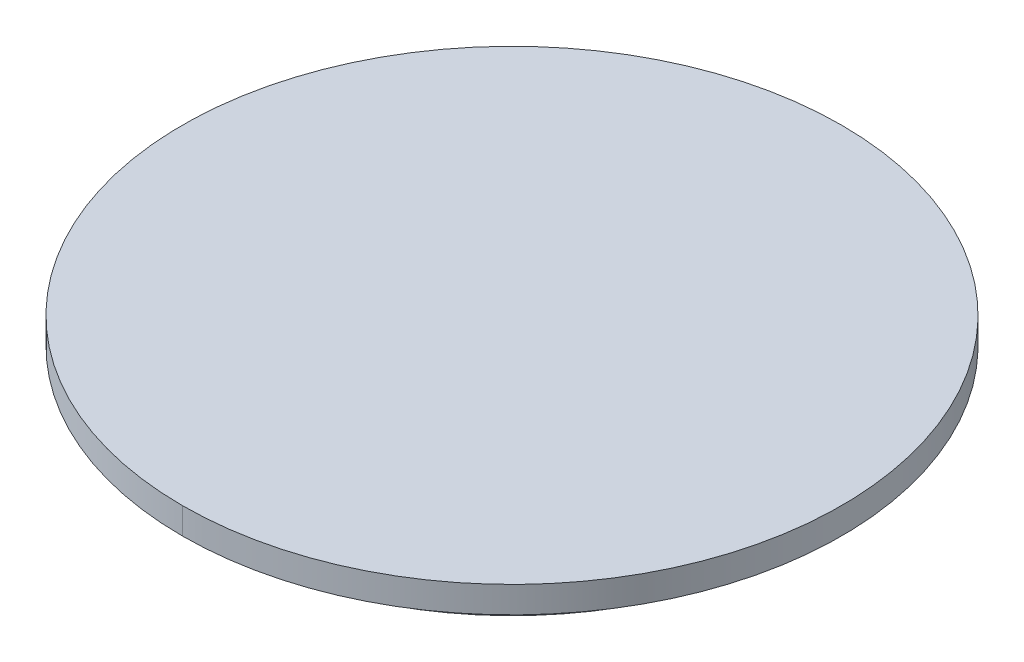
ISO-10303-21;
HEADER;
FILE_DESCRIPTION(('STEP AP214'),'2;1');
FILE_NAME('part.step','',(''),(''),'','','');
FILE_SCHEMA(('AUTOMOTIVE_DESIGN { 1 0 10303 214 1 1 1 1 }'));
ENDSEC;
DATA;
#1=APPLICATION_CONTEXT('core data for automotive mechanical design processes');
#2=APPLICATION_PROTOCOL_DEFINITION('international standard','automotive_design',2000,#1);
#3=PRODUCT_CONTEXT('',#1,'mechanical');
#4=PRODUCT('Part','Part','',(#3));
#5=PRODUCT_RELATED_PRODUCT_CATEGORY('part','',(#4));
#6=PRODUCT_DEFINITION_FORMATION('','',#4);
#7=PRODUCT_DEFINITION_CONTEXT('part definition',#1,'design');
#8=PRODUCT_DEFINITION('design','',#6,#7);
#9=PRODUCT_DEFINITION_SHAPE('','',#8);
#10=(LENGTH_UNIT() NAMED_UNIT(*) SI_UNIT(.MILLI.,.METRE.));
#11=(NAMED_UNIT(*) PLANE_ANGLE_UNIT() SI_UNIT($,.RADIAN.));
#12=(NAMED_UNIT(*) SI_UNIT($,.STERADIAN.) SOLID_ANGLE_UNIT());
#13=UNCERTAINTY_MEASURE_WITH_UNIT(LENGTH_MEASURE(1.E-05),#10,'distance_accuracy_value','');
#14=(GEOMETRIC_REPRESENTATION_CONTEXT(3) GLOBAL_UNCERTAINTY_ASSIGNED_CONTEXT((#13)) GLOBAL_UNIT_ASSIGNED_CONTEXT((#10,
#11,#12)) REPRESENTATION_CONTEXT('',''));
#15=CARTESIAN_POINT('',(0.,0.,0.));
#16=DIRECTION('',(0.,0.,1.));
#17=DIRECTION('',(1.,0.,0.));
#18=AXIS2_PLACEMENT_3D('',#15,#16,#17);
#19=CARTESIAN_POINT('',(10.,1.6,0.));
#20=DIRECTION('',(0.,-1.,0.));
#21=DIRECTION('',(0.,0.,-1.));
#22=AXIS2_PLACEMENT_3D('',#19,#20,#21);
#23=PLANE('',#22);
#24=CARTESIAN_POINT('',(0.,1.6,0.));
#25=DIRECTION('',(0.,1.,0.));
#26=DIRECTION('',(0.,0.,1.));
#27=AXIS2_PLACEMENT_3D('',#24,#25,#26);
#28=CIRCLE('',#27,10.);
#29=CARTESIAN_POINT('',(0.,1.6,10.));
#30=VERTEX_POINT('',#29);
#31=CARTESIAN_POINT('',(0.,1.6,-10.));
#32=VERTEX_POINT('',#31);
#33=EDGE_CURVE('E86',#30,#32,#28,.T.);
#34=ORIENTED_EDGE('',*,*,#33,.T.);
#35=CARTESIAN_POINT('',(0.,1.6,0.));
#36=DIRECTION('',(0.,1.,0.));
#37=DIRECTION('',(0.,0.,1.));
#38=AXIS2_PLACEMENT_3D('',#35,#36,#37);
#39=CIRCLE('',#38,10.);
#40=EDGE_CURVE('E10',#32,#30,#39,.T.);
#41=ORIENTED_EDGE('',*,*,#40,.T.);
#42=EDGE_LOOP('',(#34,#41));
#43=FACE_BOUND('',#42,.T.);
#44=ADVANCED_FACE('F16',(#43),#23,.F.);
#45=CARTESIAN_POINT('',(0.,1.6,0.));
#46=DIRECTION('',(0.,1.,0.));
#47=DIRECTION('',(0.,0.,1.));
#48=AXIS2_PLACEMENT_3D('',#45,#46,#47);
#49=CYLINDRICAL_SURFACE('',#48,10.);
#50=DIRECTION('',(0.,1.,0.));
#51=VECTOR('',#50,1.);
#52=CARTESIAN_POINT('',(0.,1.6,-10.));
#53=LINE('',#52,#51);
#54=CARTESIAN_POINT('',(0.,0.8,-10.));
#55=VERTEX_POINT('',#54);
#56=EDGE_CURVE('E77',#55,#32,#53,.T.);
#57=ORIENTED_EDGE('',*,*,#56,.F.);
#58=CARTESIAN_POINT('',(0.,0.8,0.));
#59=DIRECTION('',(0.,1.,0.));
#60=DIRECTION('',(0.,0.,1.));
#61=AXIS2_PLACEMENT_3D('',#58,#59,#60);
#62=CIRCLE('',#61,10.);
#63=CARTESIAN_POINT('',(0.,0.8,10.));
#64=VERTEX_POINT('',#63);
#65=EDGE_CURVE('E20',#55,#64,#62,.T.);
#66=ORIENTED_EDGE('',*,*,#65,.T.);
#67=DIRECTION('',(0.,1.,0.));
#68=VECTOR('',#67,1.);
#69=CARTESIAN_POINT('',(0.,1.6,10.));
#70=LINE('',#69,#68);
#71=EDGE_CURVE('E74',#64,#30,#70,.T.);
#72=ORIENTED_EDGE('',*,*,#71,.T.);
#73=ORIENTED_EDGE('',*,*,#40,.F.);
#74=EDGE_LOOP('',(#57,#66,#72,#73));
#75=FACE_BOUND('',#74,.T.);
#76=ADVANCED_FACE('F18',(#75),#49,.T.);
#77=CARTESIAN_POINT('',(8.9,0.8,0.));
#78=DIRECTION('',(0.,1.,0.));
#79=DIRECTION('',(1.,0.,0.));
#80=AXIS2_PLACEMENT_3D('',#77,#78,#79);
#81=PLANE('',#80);
#82=CARTESIAN_POINT('',(0.,0.8,0.));
#83=DIRECTION('',(0.,1.,0.));
#84=DIRECTION('',(0.,0.,1.));
#85=AXIS2_PLACEMENT_3D('',#82,#83,#84);
#86=CIRCLE('',#85,8.9);
#87=CARTESIAN_POINT('',(0.,0.8,8.9));
#88=VERTEX_POINT('',#87);
#89=CARTESIAN_POINT('',(0.,0.8,-8.9));
#90=VERTEX_POINT('',#89);
#91=EDGE_CURVE('E111',#88,#90,#86,.T.);
#92=ORIENTED_EDGE('',*,*,#91,.T.);
#93=CARTESIAN_POINT('',(0.,0.8,0.));
#94=DIRECTION('',(0.,1.,0.));
#95=DIRECTION('',(0.,0.,1.));
#96=AXIS2_PLACEMENT_3D('',#93,#94,#95);
#97=CIRCLE('',#96,8.9);
#98=EDGE_CURVE('E38',#90,#88,#97,.T.);
#99=ORIENTED_EDGE('',*,*,#98,.T.);
#100=EDGE_LOOP('',(#92,#99));
#101=FACE_BOUND('',#100,.T.);
#102=CARTESIAN_POINT('',(0.,0.8,0.));
#103=DIRECTION('',(0.,1.,0.));
#104=DIRECTION('',(0.,0.,1.));
#105=AXIS2_PLACEMENT_3D('',#102,#103,#104);
#106=CIRCLE('',#105,10.);
#107=EDGE_CURVE('E84',#64,#55,#106,.T.);
#108=ORIENTED_EDGE('',*,*,#107,.F.);
#109=ORIENTED_EDGE('',*,*,#65,.F.);
#110=EDGE_LOOP('',(#108,#109));
#111=FACE_BOUND('',#110,.T.);
#112=ADVANCED_FACE('F90',(#101,#111),#81,.F.);
#113=CARTESIAN_POINT('',(0.,1.6,0.));
#114=DIRECTION('',(0.,1.,0.));
#115=DIRECTION('',(0.,0.,1.));
#116=AXIS2_PLACEMENT_3D('',#113,#114,#115);
#117=CYLINDRICAL_SURFACE('',#116,8.9);
#118=DIRECTION('',(0.,1.,0.));
#119=VECTOR('',#118,1.);
#120=CARTESIAN_POINT('',(0.,1.6,-8.9));
#121=LINE('',#120,#119);
#122=CARTESIAN_POINT('',(0.,0.,-8.9));
#123=VERTEX_POINT('',#122);
#124=EDGE_CURVE('E102',#123,#90,#121,.T.);
#125=ORIENTED_EDGE('',*,*,#124,.F.);
#126=CARTESIAN_POINT('',(0.,0.,0.));
#127=DIRECTION('',(0.,1.,0.));
#128=DIRECTION('',(0.,0.,1.));
#129=AXIS2_PLACEMENT_3D('',#126,#127,#128);
#130=CIRCLE('',#129,8.9);
#131=CARTESIAN_POINT('',(0.,0.,8.9));
#132=VERTEX_POINT('',#131);
#133=EDGE_CURVE('E105',#123,#132,#130,.T.);
#134=ORIENTED_EDGE('',*,*,#133,.T.);
#135=DIRECTION('',(0.,1.,0.));
#136=VECTOR('',#135,1.);
#137=CARTESIAN_POINT('',(0.,1.6,8.9));
#138=LINE('',#137,#136);
#139=EDGE_CURVE('E108',#132,#88,#138,.T.);
#140=ORIENTED_EDGE('',*,*,#139,.T.);
#141=ORIENTED_EDGE('',*,*,#98,.F.);
#142=EDGE_LOOP('',(#125,#134,#140,#141));
#143=FACE_BOUND('',#142,.T.);
#144=ADVANCED_FACE('F180',(#143),#117,.T.);
#145=CARTESIAN_POINT('',(0.,0.,0.));
#146=DIRECTION('',(0.,1.,0.));
#147=DIRECTION('',(1.,0.,0.));
#148=AXIS2_PLACEMENT_3D('',#145,#146,#147);
#149=PLANE('',#148);
#150=CARTESIAN_POINT('',(0.,0.,0.));
#151=DIRECTION('',(0.,1.,0.));
#152=DIRECTION('',(0.,0.,1.));
#153=AXIS2_PLACEMENT_3D('',#150,#151,#152);
#154=CIRCLE('',#153,8.9);
#155=EDGE_CURVE('E88',#132,#123,#154,.T.);
#156=ORIENTED_EDGE('',*,*,#155,.F.);
#157=ORIENTED_EDGE('',*,*,#133,.F.);
#158=EDGE_LOOP('',(#156,#157));
#159=FACE_BOUND('',#158,.T.);
#160=ADVANCED_FACE('F187',(#159),#149,.F.);
#161=CARTESIAN_POINT('',(0.,1.6,0.));
#162=DIRECTION('',(0.,1.,0.));
#163=DIRECTION('',(0.,0.,1.));
#164=AXIS2_PLACEMENT_3D('',#161,#162,#163);
#165=CYLINDRICAL_SURFACE('',#164,8.9);
#166=ORIENTED_EDGE('',*,*,#155,.T.);
#167=ORIENTED_EDGE('',*,*,#124,.T.);
#168=ORIENTED_EDGE('',*,*,#91,.F.);
#169=ORIENTED_EDGE('',*,*,#139,.F.);
#170=EDGE_LOOP('',(#166,#167,#168,#169));
#171=FACE_BOUND('',#170,.T.);
#172=ADVANCED_FACE('F195',(#171),#165,.T.);
#173=CARTESIAN_POINT('',(0.,1.6,0.));
#174=DIRECTION('',(0.,1.,0.));
#175=DIRECTION('',(0.,0.,1.));
#176=AXIS2_PLACEMENT_3D('',#173,#174,#175);
#177=CYLINDRICAL_SURFACE('',#176,10.);
#178=ORIENTED_EDGE('',*,*,#107,.T.);
#179=ORIENTED_EDGE('',*,*,#56,.T.);
#180=ORIENTED_EDGE('',*,*,#33,.F.);
#181=ORIENTED_EDGE('',*,*,#71,.F.);
#182=EDGE_LOOP('',(#178,#179,#180,#181));
#183=FACE_BOUND('',#182,.T.);
#184=ADVANCED_FACE('F83',(#183),#177,.T.);
#185=CLOSED_SHELL('',(#44,#76,#112,#144,#160,#172,#184));
#186=MANIFOLD_SOLID_BREP('B1',#185);
#187=ADVANCED_BREP_SHAPE_REPRESENTATION('',(#18,#186),#14);
#188=SHAPE_DEFINITION_REPRESENTATION(#9,#187);
ENDSEC;
END-ISO-10303-21;
